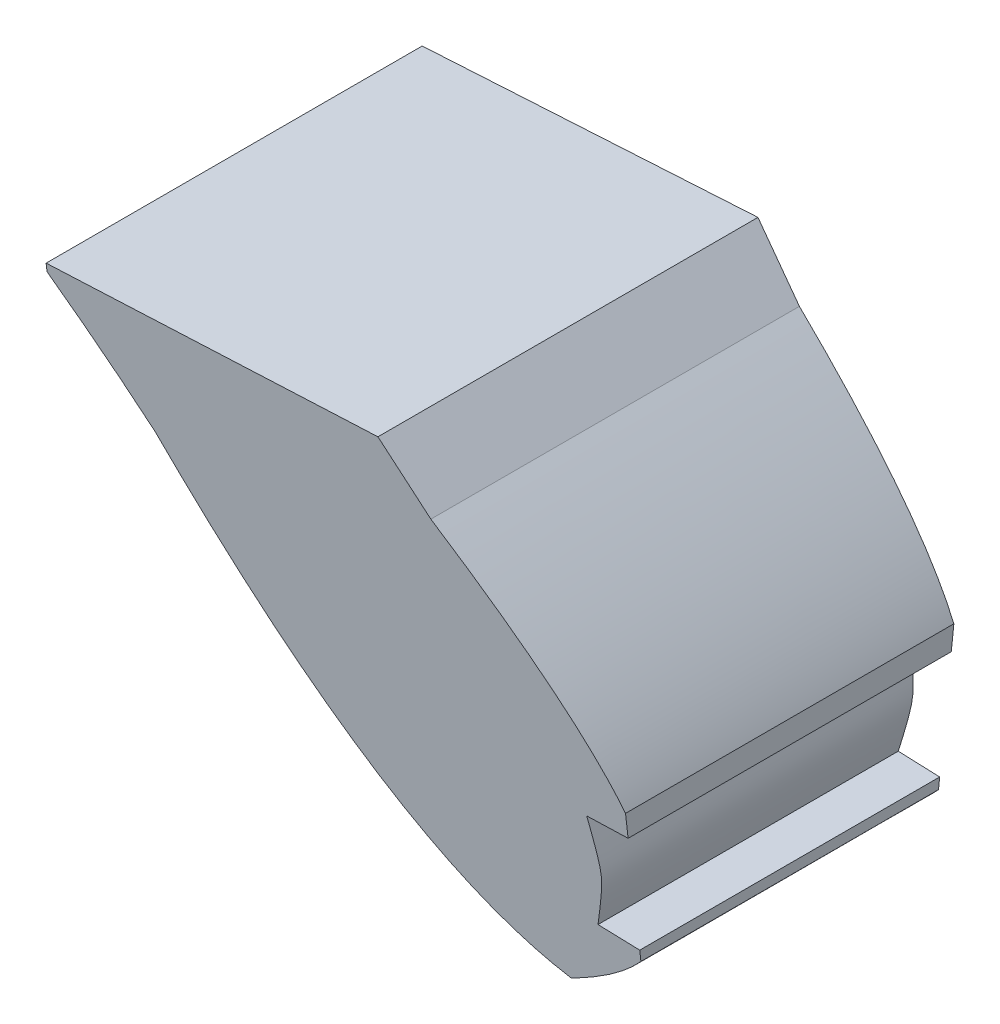
ISO-10303-21;
HEADER;
FILE_DESCRIPTION(('STEP AP214'),'2;1');
FILE_NAME('part.step','',(''),(''),'','','');
FILE_SCHEMA(('AUTOMOTIVE_DESIGN { 1 0 10303 214 1 1 1 1 }'));
ENDSEC;
DATA;
#1=APPLICATION_CONTEXT('core data for automotive mechanical design processes');
#2=APPLICATION_PROTOCOL_DEFINITION('international standard','automotive_design',2000,#1);
#3=PRODUCT_CONTEXT('',#1,'mechanical');
#4=PRODUCT('Part','Part','',(#3));
#5=PRODUCT_RELATED_PRODUCT_CATEGORY('part','',(#4));
#6=PRODUCT_DEFINITION_FORMATION('','',#4);
#7=PRODUCT_DEFINITION_CONTEXT('part definition',#1,'design');
#8=PRODUCT_DEFINITION('design','',#6,#7);
#9=PRODUCT_DEFINITION_SHAPE('','',#8);
#10=(LENGTH_UNIT() NAMED_UNIT(*) SI_UNIT(.MILLI.,.METRE.));
#11=(NAMED_UNIT(*) PLANE_ANGLE_UNIT() SI_UNIT($,.RADIAN.));
#12=(NAMED_UNIT(*) SI_UNIT($,.STERADIAN.) SOLID_ANGLE_UNIT());
#13=UNCERTAINTY_MEASURE_WITH_UNIT(LENGTH_MEASURE(1.E-05),#10,'distance_accuracy_value','');
#14=(GEOMETRIC_REPRESENTATION_CONTEXT(3) GLOBAL_UNCERTAINTY_ASSIGNED_CONTEXT((#13)) GLOBAL_UNIT_ASSIGNED_CONTEXT((#10,
#11,#12)) REPRESENTATION_CONTEXT('',''));
#15=CARTESIAN_POINT('',(0.,0.,0.));
#16=DIRECTION('',(0.,0.,1.));
#17=DIRECTION('',(1.,0.,0.));
#18=AXIS2_PLACEMENT_3D('',#15,#16,#17);
#19=CARTESIAN_POINT('',(0.355125000055651,-1.23774703808888E-13,8.));
#20=DIRECTION('',(-1.,3.48538412642003E-13,0.));
#21=DIRECTION('',(-3.48538412642003E-13,-1.,0.));
#22=AXIS2_PLACEMENT_3D('',#19,#20,#21);
#23=PLANE('',#22);
#24=DIRECTION('',(0.,-0.993653373689782,0.112485434412263));
#25=VECTOR('',#24,1.);
#26=CARTESIAN_POINT('',(0.355125000056697,12.6081551722012,-8.));
#27=LINE('',#26,#25);
#28=CARTESIAN_POINT('',(0.355125000056697,3.0015495286345,-6.91249480185305));
#29=VERTEX_POINT('',#28);
#30=CARTESIAN_POINT('',(0.355125000056447,2.03738091179555,-6.80334715682562));
#31=VERTEX_POINT('',#30);
#32=EDGE_CURVE('E59',#29,#31,#27,.T.);
#33=ORIENTED_EDGE('',*,*,#32,.F.);
#34=DIRECTION('',(0.,0.,-1.));
#35=VECTOR('',#34,1.);
#36=CARTESIAN_POINT('',(0.355125000056697,3.0015495286345,8.));
#37=LINE('',#36,#35);
#38=CARTESIAN_POINT('',(0.355125000056697,3.0015495286345,6.91249480185305));
#39=VERTEX_POINT('',#38);
#40=EDGE_CURVE('E179',#39,#29,#37,.T.);
#41=ORIENTED_EDGE('',*,*,#40,.F.);
#42=DIRECTION('',(0.,0.993653373689782,0.112485434412263));
#43=VECTOR('',#42,1.);
#44=CARTESIAN_POINT('',(0.355125000056697,12.6081551722012,8.));
#45=LINE('',#44,#43);
#46=CARTESIAN_POINT('',(0.355125000056697,2.03738091179556,6.80334715682562));
#47=VERTEX_POINT('',#46);
#48=EDGE_CURVE('E151',#47,#39,#45,.T.);
#49=ORIENTED_EDGE('',*,*,#48,.F.);
#50=DIRECTION('',(0.,0.,-1.));
#51=VECTOR('',#50,1.);
#52=CARTESIAN_POINT('',(0.355125000056447,2.03738091179555,8.));
#53=LINE('',#52,#51);
#54=EDGE_CURVE('E166',#47,#31,#53,.T.);
#55=ORIENTED_EDGE('',*,*,#54,.T.);
#56=EDGE_LOOP('',(#33,#41,#49,#55));
#57=FACE_BOUND('',#56,.T.);
#58=ADVANCED_FACE('F41',(#57),#23,.F.);
#59=CARTESIAN_POINT('',(-23.0359211456035,0.,8.));
#60=DIRECTION('',(-1.,0.,0.));
#61=DIRECTION('',(0.,0.,1.));
#62=AXIS2_PLACEMENT_3D('',#59,#60,#61);
#63=PLANE('',#62);
#64=DIRECTION('',(0.,0.,-1.));
#65=VECTOR('',#64,1.);
#66=CARTESIAN_POINT('',(-23.0359211456035,11.8716122879342,8.));
#67=LINE('',#66,#65);
#68=CARTESIAN_POINT('',(-23.0359211456035,11.8716122879342,7.91662047501294));
#69=VERTEX_POINT('',#68);
#70=CARTESIAN_POINT('',(-23.0359211456035,11.8716122879342,-7.91662047501294));
#71=VERTEX_POINT('',#70);
#72=EDGE_CURVE('E187',#69,#71,#67,.T.);
#73=ORIENTED_EDGE('',*,*,#72,.T.);
#74=DIRECTION('',(0.,-0.993653373689782,0.112485434412263));
#75=VECTOR('',#74,1.);
#76=CARTESIAN_POINT('',(-23.0359211456035,12.6081551722012,-8.));
#77=LINE('',#76,#75);
#78=CARTESIAN_POINT('',(-23.0359211456035,11.5401378200983,-7.87909627341673));
#79=VERTEX_POINT('',#78);
#80=EDGE_CURVE('E317',#71,#79,#77,.T.);
#81=ORIENTED_EDGE('',*,*,#80,.T.);
#82=DIRECTION('',(0.,0.,-1.));
#83=VECTOR('',#82,1.);
#84=CARTESIAN_POINT('',(-23.0359211456035,11.5401378200983,8.));
#85=LINE('',#84,#83);
#86=CARTESIAN_POINT('',(-23.0359211456035,11.5401378200983,7.87909627341673));
#87=VERTEX_POINT('',#86);
#88=EDGE_CURVE('E193',#87,#79,#85,.T.);
#89=ORIENTED_EDGE('',*,*,#88,.F.);
#90=DIRECTION('',(0.,0.993653373689782,0.112485434412263));
#91=VECTOR('',#90,1.);
#92=CARTESIAN_POINT('',(-23.0359211456035,12.6081551722012,8.));
#93=LINE('',#92,#91);
#94=EDGE_CURVE('E320',#87,#69,#93,.T.);
#95=ORIENTED_EDGE('',*,*,#94,.T.);
#96=EDGE_LOOP('',(#73,#81,#89,#95));
#97=FACE_BOUND('',#96,.T.);
#98=ADVANCED_FACE('F316',(#97),#63,.T.);
#99=CARTESIAN_POINT('',(-18.9451921135982,7.54091889574655,8.));
#100=CARTESIAN_POINT('',(-10.2150083842792,-3.69764410322756,8.));
#101=CARTESIAN_POINT('',(-2.84660482498738,-5.05908110388432,8.));
#102=(BOUNDED_CURVE() B_SPLINE_CURVE(2,(#99,#100,#101),.UNSPECIFIED.,.F.,
.F.) B_SPLINE_CURVE_WITH_KNOTS((3,3),(0.497667241108509,0.499554279588011),
.UNSPECIFIED.) CURVE() GEOMETRIC_REPRESENTATION_ITEM() RATIONAL_B_SPLINE_CURVE((1.,1.,1.)) REPRESENTATION_ITEM(''));
#103=DIRECTION('',(0.,0.,-1.));
#104=VECTOR('',#103,1.);
#105=SURFACE_OF_LINEAR_EXTRUSION('',#102,#104);
#106=DIRECTION('',(0.,0.,-1.));
#107=VECTOR('',#106,1.);
#108=CARTESIAN_POINT('',(-18.9451921135982,7.54091889574657,8.));
#109=LINE('',#108,#107);
#110=CARTESIAN_POINT('',(-18.9451921135982,7.54091889574657,7.42636910524442));
#111=VERTEX_POINT('',#110);
#112=CARTESIAN_POINT('',(-18.9451921135982,7.54091889574657,-7.42636910524442));
#113=VERTEX_POINT('',#112);
#114=EDGE_CURVE('E194',#111,#113,#109,.T.);
#115=ORIENTED_EDGE('',*,*,#114,.T.);
#116=CARTESIAN_POINT('',(-18.9451921135982,7.54091889574655,-7.42636910524441));
#117=CARTESIAN_POINT('',(-18.7033608655423,7.22962108931645,-7.39112898035273));
#118=CARTESIAN_POINT('',(-18.4592647140916,6.9200497206851,-7.35608429494821));
#119=CARTESIAN_POINT('',(-17.9661198805234,6.30464603742845,-7.28641819962467));
#120=CARTESIAN_POINT('',(-17.7170694462669,5.99881510969872,-7.25179694670763));
#121=CARTESIAN_POINT('',(-17.2137366178937,5.3913665824337,-7.18303140604553));
#122=CARTESIAN_POINT('',(-16.9594535947769,5.08974949683998,-7.14888717648066));
#123=CARTESIAN_POINT('',(-16.4451285665965,4.49103725761873,-7.08111061767257));
#124=CARTESIAN_POINT('',(-16.1850826962375,4.19394537928884,-7.04747865920581));
#125=CARTESIAN_POINT('',(-15.6590118901181,3.60508061675355,-6.9808168731366));
#126=CARTESIAN_POINT('',(-15.3929875534481,3.31330720485499,-6.94778698579723));
#127=CARTESIAN_POINT('',(-14.8544901847056,2.7357195544677,-6.88240181277285));
#128=CARTESIAN_POINT('',(-14.5820174931064,2.44990500284308,-6.85004649163962));
#129=CARTESIAN_POINT('',(-13.9777704357619,1.83142011947111,-6.78003159245484));
#130=CARTESIAN_POINT('',(-13.6445482479649,1.50014167377654,-6.74252958132897));
#131=CARTESIAN_POINT('',(-12.9673134934436,0.848664446736888,-6.66877982026176));
#132=CARTESIAN_POINT('',(-12.623301443116,0.528465136688493,-6.63253201046914));
#133=CARTESIAN_POINT('',(-11.9227759490938,-0.0995013958587513,-6.5614437516454));
#134=CARTESIAN_POINT('',(-11.5662405708663,-0.407244542107335,-6.52660602813964));
#135=CARTESIAN_POINT('',(-10.840142749037,-1.00720368374379,-6.45868831511867));
#136=CARTESIAN_POINT('',(-10.4705807273197,-1.29942018121482,-6.4256082687657));
#137=CARTESIAN_POINT('',(-9.71382699072171,-1.86779135556405,-6.36126643674768));
#138=CARTESIAN_POINT('',(-9.32650636654571,-2.14377746328672,-6.330023733768));
#139=CARTESIAN_POINT('',(-8.5360986768139,-2.67282289543975,-6.27013372902864));
#140=CARTESIAN_POINT('',(-8.13300835344273,-2.92587744631612,-6.24148696765387));
#141=CARTESIAN_POINT('',(-7.31201826568453,-3.40280761684766,-6.18749661363601));
#142=CARTESIAN_POINT('',(-6.89419365451789,-3.62680992502778,-6.16213867935817));
#143=CARTESIAN_POINT('',(-6.04187322097519,-4.0405536088069,-6.11530128189388));
#144=CARTESIAN_POINT('',(-5.60738935372736,-4.23031901573022,-6.09381909826786));
#145=CARTESIAN_POINT('',(-4.78985442909107,-4.54236533838515,-6.05849423842238));
#146=CARTESIAN_POINT('',(-4.4091055725695,-4.67052923075731,-6.04398558631979));
#147=CARTESIAN_POINT('',(-3.82960691198316,-4.83674345690554,-6.02516948814227));
#148=CARTESIAN_POINT('',(-3.63462104960687,-4.8878904691115,-6.01937944702812));
#149=CARTESIAN_POINT('',(-3.24229120544362,-4.9807402777546,-6.00886848683127));
#150=CARTESIAN_POINT('',(-3.0449461414238,-5.02243854990591,-6.00414807991536));
#151=CARTESIAN_POINT('',(-2.84660482498738,-5.05908110388432,-6.));
#152=B_SPLINE_CURVE_WITH_KNOTS('',3,(#116,#117,#118,#119,#120,#121,#122,#123,#124,#125,#126,
#127,#128,#129,#130,#131,#132,#133,#134,#135,#136,#137,#138,#139,#140,#141,#142,#143,#144,#145,
#146,#147,#148,#149,#150,#151),.UNSPECIFIED.,.F.,.F.,(4,2,2,2,2,2,2,2,2,2,2,2,2,2,2,2,2,4),(0.,
1.1872997216569,2.37502708567824,3.56289806807204,4.75159146291787,5.9401662676152,
7.12867845491363,8.54255640265696,9.95636678593971,11.3727907462706,12.7891688759803,
14.2183172044781,15.6477623519031,17.0707480146133,18.4927309460623,19.6971402338765,
20.3019233237111,20.9069953892921),.UNSPECIFIED.);
#153=CARTESIAN_POINT('',(-2.84660482498738,-5.05908110388432,-6.));
#154=VERTEX_POINT('',#153);
#155=EDGE_CURVE('E255',#113,#154,#152,.T.);
#156=ORIENTED_EDGE('',*,*,#155,.T.);
#157=DIRECTION('',(0.,0.,-1.));
#158=VECTOR('',#157,1.);
#159=CARTESIAN_POINT('',(-2.84660482498738,-5.05908110388432,8.));
#160=LINE('',#159,#158);
#161=CARTESIAN_POINT('',(-2.84660482498738,-5.05908110388432,6.));
#162=VERTEX_POINT('',#161);
#163=EDGE_CURVE('E156',#162,#154,#160,.T.);
#164=ORIENTED_EDGE('',*,*,#163,.F.);
#165=CARTESIAN_POINT('',(-2.84660482498738,-5.05908110388432,6.));
#166=CARTESIAN_POINT('',(-3.0836355452615,-5.01529762547054,6.00495646039138));
#167=CARTESIAN_POINT('',(-3.31925014057108,-4.96428184629726,6.01073164541478));
#168=CARTESIAN_POINT('',(-3.78628189704186,-4.84911384389608,6.02376911212451));
#169=CARTESIAN_POINT('',(-4.01771143135529,-4.78501130060695,6.03102576984815));
#170=CARTESIAN_POINT('',(-4.47638324853452,-4.64477679089168,6.04690086287615));
#171=CARTESIAN_POINT('',(-4.70363211310207,-4.56866593727755,6.05551690812791));
#172=CARTESIAN_POINT('',(-5.15398016115681,-4.40545252874729,6.07399330205617));
#173=CARTESIAN_POINT('',(-5.37708095327682,-4.31835434125152,6.08385315632366));
#174=CARTESIAN_POINT('',(-5.81545834234536,-4.13567110279715,6.10453361087802));
#175=CARTESIAN_POINT('',(-6.03080317783365,-4.04024711994086,6.11533597762798));
#176=CARTESIAN_POINT('',(-6.45748946905634,-3.84057736608456,6.13793937192646));
#177=CARTESIAN_POINT('',(-6.66882789943329,-3.73632522989765,6.14974112003892));
#178=CARTESIAN_POINT('',(-7.08747417766979,-3.51983158147829,6.17424904476877));
#179=CARTESIAN_POINT('',(-7.29477947597257,-3.40758521204135,6.18695577124062));
#180=CARTESIAN_POINT('',(-7.70530843131035,-3.17590609220346,6.21318275051655));
#181=CARTESIAN_POINT('',(-7.90853147430462,-3.0564722713248,6.22670312450288));
#182=CARTESIAN_POINT('',(-8.45410340689061,-2.72385368196738,6.26435684511426));
#183=CARTESIAN_POINT('',(-8.79259906035209,-2.50440768840731,6.28919898682003));
#184=CARTESIAN_POINT('',(-9.45845448583479,-2.04949644973372,6.3406967119384));
#185=CARTESIAN_POINT('',(-9.78581359629267,-1.81403025542841,6.3673524028032));
#186=CARTESIAN_POINT('',(-10.4302582396863,-1.32938575303013,6.42221604925302));
#187=CARTESIAN_POINT('',(-10.7473396395034,-1.08020203459831,6.45042461730948));
#188=CARTESIAN_POINT('',(-11.3718438106499,-0.570176876647104,6.50816145288252));
#189=CARTESIAN_POINT('',(-11.6792662750814,-0.309335067346119,6.53768976225981));
#190=CARTESIAN_POINT('',(-12.2887351366992,0.225514030316342,6.59823676455314));
#191=CARTESIAN_POINT('',(-12.5906756597182,0.499640146613562,6.62926890925461));
#192=CARTESIAN_POINT('',(-13.1859914625247,1.05668157973797,6.69232817041119));
#193=CARTESIAN_POINT('',(-13.4793699933214,1.33959347409339,6.72435489942917));
#194=CARTESIAN_POINT('',(-14.0582984741035,1.91313890151101,6.78928247705987));
#195=CARTESIAN_POINT('',(-14.3438493181123,2.20377154523463,6.82218322499598));
#196=CARTESIAN_POINT('',(-14.9077244427009,2.7918210558895,6.88875272137508));
#197=CARTESIAN_POINT('',(-15.1860493084316,3.08923736980037,6.92242140721399));
#198=CARTESIAN_POINT('',(-15.7683607406539,3.72540309630891,6.99443784674841));
#199=CARTESIAN_POINT('',(-16.0715178451228,4.06490144250158,7.03287038264566));
#200=CARTESIAN_POINT('',(-16.6701836985208,4.7504922746204,7.11048193675692));
#201=CARTESIAN_POINT('',(-16.9656923307507,5.09658486102068,7.14966096634501));
#202=CARTESIAN_POINT('',(-17.4495199616275,5.67490501691598,7.21512906184765));
#203=CARTESIAN_POINT('',(-17.6398456690967,5.90547984199544,7.24123103065322));
#204=CARTESIAN_POINT('',(-18.0176052393411,6.36895711711416,7.29369846448112));
#205=CARTESIAN_POINT('',(-18.205039097963,6.60185957049552,7.3200639298818));
#206=CARTESIAN_POINT('',(-18.5771476687389,7.06981539005112,7.37303835239394));
#207=CARTESIAN_POINT('',(-18.7618224957771,7.30486866600559,7.39964729929217));
#208=CARTESIAN_POINT('',(-18.9451921135982,7.54091889574655,7.42636910524441));
#209=B_SPLINE_CURVE_WITH_KNOTS('',3,(#165,#166,#167,#168,#169,#170,#171,#172,#173,#174,#175,
#176,#177,#178,#179,#180,#181,#182,#183,#184,#185,#186,#187,#188,#189,#190,#191,#192,#193,#194,
#195,#196,#197,#198,#199,#200,#201,#202,#203,#204,#205,#206,#207,#208),.UNSPECIFIED.,.F.,.F.,(4,
2,2,2,2,2,2,2,2,2,2,2,2,2,2,2,2,2,2,2,2,4),(0.,0.723070627629283,1.44344574109941,
2.16256813451498,2.88140557514503,3.58855192345824,4.2962125448096,5.0043068623572,
5.71250690363926,6.92441762508089,8.13640021448464,9.3488642962315,10.5613668633146,
11.788141520998,13.0144441434254,14.2406061176645,15.4666684871313,16.8368576095009,
18.2070676256843,19.1073954524656,20.0077245721621,20.9080160976373),.UNSPECIFIED.);
#210=EDGE_CURVE('E134',#162,#111,#209,.T.);
#211=ORIENTED_EDGE('',*,*,#210,.T.);
#212=EDGE_LOOP('',(#115,#156,#164,#211));
#213=FACE_BOUND('',#212,.T.);
#214=ADVANCED_FACE('F43',(#213),#105,.F.);
#215=CARTESIAN_POINT('',(-2.84660482498738,-5.05908110388432,8.));
#216=CARTESIAN_POINT('',(-0.742366881974002,-3.93520659958673,8.));
#217=CARTESIAN_POINT('',(0.355124999965198,-2.72325322699678,8.));
#218=(BOUNDED_CURVE() B_SPLINE_CURVE(2,(#215,#216,#217),.UNSPECIFIED.,.F.,
.F.) B_SPLINE_CURVE_WITH_KNOTS((3,3),(0.498812074629495,0.499412845463797),
.UNSPECIFIED.) CURVE() GEOMETRIC_REPRESENTATION_ITEM() RATIONAL_B_SPLINE_CURVE((1.,1.,1.)) REPRESENTATION_ITEM(''));
#219=DIRECTION('',(0.,0.,-1.));
#220=VECTOR('',#219,1.);
#221=SURFACE_OF_LINEAR_EXTRUSION('',#218,#220);
#222=ORIENTED_EDGE('',*,*,#163,.T.);
#223=CARTESIAN_POINT('',(-2.84660482498738,-5.05908110388432,-6.));
#224=CARTESIAN_POINT('',(-2.67154367534484,-4.96554243060771,-6.01058894235803));
#225=CARTESIAN_POINT('',(-2.49778385523126,-4.86952307483158,-6.02145870764283));
#226=CARTESIAN_POINT('',(-2.15332890723938,-4.67164155861341,-6.04385966647148));
#227=CARTESIAN_POINT('',(-1.9826387176766,-4.56977092703724,-6.05539181898071));
#228=CARTESIAN_POINT('',(-1.64527137465746,-4.35955519460265,-6.0791890591545));
#229=CARTESIAN_POINT('',(-1.47859514121983,-4.25120862887406,-6.09145431264808));
#230=CARTESIAN_POINT('',(-1.15044448784201,-4.02724001195876,-6.11680843294344));
#231=CARTESIAN_POINT('',(-0.98896568487432,-3.911624347545,-6.12989657673763));
#232=CARTESIAN_POINT('',(-0.724614348138144,-3.7114805449727,-6.15255363519824));
#233=CARTESIAN_POINT('',(-0.619967455079453,-3.6292658395869,-6.16186066025876));
#234=CARTESIAN_POINT('',(-0.414118763296717,-3.46070156785231,-6.18094279275538));
#235=CARTESIAN_POINT('',(-0.312916415666604,-3.3743526656372,-6.19071782500895));
#236=CARTESIAN_POINT('',(-0.114288127047668,-3.19685300163986,-6.21081147873311));
#237=CARTESIAN_POINT('',(-0.0168745915935633,-3.10568844995875,-6.221131661274));
#238=CARTESIAN_POINT('',(0.173044677325634,-2.91833195578561,-6.24234114658855));
#239=CARTESIAN_POINT('',(0.265547074526193,-2.82213668167119,-6.25323082651485));
#240=CARTESIAN_POINT('',(0.355124999965198,-2.72325322699678,-6.26442481895704));
#241=B_SPLINE_CURVE_WITH_KNOTS('',3,(#223,#224,#225,#226,#227,#228,#229,#230,#231,#232,#233,
#234,#235,#236,#237,#238,#239,#240),.UNSPECIFIED.,.F.,.F.,(4,2,2,2,2,2,2,2,4),(0.,
0.596333361221147,1.19355295493407,1.79090815604603,2.38774565156578,2.78786762990545,
3.18792554534165,3.58919872466333,3.99074110013676),.UNSPECIFIED.);
#242=CARTESIAN_POINT('',(0.355125000010947,-2.72325322699678,-6.26442481895704));
#243=VERTEX_POINT('',#242);
#244=EDGE_CURVE('E154',#154,#243,#241,.T.);
#245=ORIENTED_EDGE('',*,*,#244,.T.);
#246=DIRECTION('',(0.,0.,-1.));
#247=VECTOR('',#246,1.);
#248=CARTESIAN_POINT('',(0.355124999965198,-2.72325322699678,8.));
#249=LINE('',#248,#247);
#250=CARTESIAN_POINT('',(0.355125000010947,-2.72325322699678,6.26442481895704));
#251=VERTEX_POINT('',#250);
#252=EDGE_CURVE('E150',#251,#243,#249,.T.);
#253=ORIENTED_EDGE('',*,*,#252,.F.);
#254=CARTESIAN_POINT('',(0.355124999965198,-2.72325322699678,6.26442481895704));
#255=CARTESIAN_POINT('',(0.288265800066398,-2.79707578870119,6.25606781726749));
#256=CARTESIAN_POINT('',(0.219762299322532,-2.86939557158838,6.24788093599675));
#257=CARTESIAN_POINT('',(0.0798741499126207,-3.0111837154317,6.23182996553057));
#258=CARTESIAN_POINT('',(0.00849051694650468,-3.08065306448068,6.22396576447915));
#259=CARTESIAN_POINT('',(-0.209110404202349,-3.28478130911614,6.20085765164865));
#260=CARTESIAN_POINT('',(-0.359086186155244,-3.41549544786354,6.18606030171743));
#261=CARTESIAN_POINT('',(-0.666431647279958,-3.66745151891472,6.15753789253991));
#262=CARTESIAN_POINT('',(-0.823790135326829,-3.78870709059741,6.14381128926277));
#263=CARTESIAN_POINT('',(-1.14463764434189,-4.02329424679429,6.11725510893767));
#264=CARTESIAN_POINT('',(-1.30813354467851,-4.13661650521983,6.1044265876393));
#265=CARTESIAN_POINT('',(-1.58497175174893,-4.31986712055689,6.08368190381061));
#266=CARTESIAN_POINT('',(-1.69701528140079,-4.39175032218513,6.07554444523986));
#267=CARTESIAN_POINT('',(-1.92294333828473,-4.53261962763427,6.05959749086083));
#268=CARTESIAN_POINT('',(-2.03682799400811,-4.6016055280346,6.05178801808056));
#269=CARTESIAN_POINT('',(-2.26591352019373,-4.73675126913538,6.0364889934919));
#270=CARTESIAN_POINT('',(-2.38111062922232,-4.80291742324192,6.02899872698133));
#271=CARTESIAN_POINT('',(-2.6128736149529,-4.93278949726635,6.01429670205848));
#272=CARTESIAN_POINT('',(-2.72943923096306,-4.99649587614853,6.00708489168965));
#273=CARTESIAN_POINT('',(-2.84660482498738,-5.05908110388432,6.));
#274=B_SPLINE_CURVE_WITH_KNOTS('',3,(#254,#255,#256,#257,#258,#259,#260,#261,#262,#263,#264,
#265,#266,#267,#268,#269,#270,#271,#272,#273),.UNSPECIFIED.,.F.,.F.,(4,2,2,2,2,2,2,2,2,4),(0.,
0.299782926841572,0.599461041577767,1.1974499434567,1.79455995327913,2.39236050766276,
2.79242459253001,3.19251671924541,3.59166012626068,3.99072869445439),.UNSPECIFIED.);
#275=EDGE_CURVE('E129',#251,#162,#274,.T.);
#276=ORIENTED_EDGE('',*,*,#275,.T.);
#277=EDGE_LOOP('',(#222,#245,#253,#276));
#278=FACE_BOUND('',#277,.T.);
#279=ADVANCED_FACE('F152',(#278),#221,.F.);
#280=CARTESIAN_POINT('',(0.355125000532009,-7.39148800447813E-11,8.));
#281=DIRECTION('',(1.,-2.08137641489758E-10,0.));
#282=DIRECTION('',(2.08137641489758E-10,1.,0.));
#283=AXIS2_PLACEMENT_3D('',#280,#281,#282);
#284=PLANE('',#283);
#285=CARTESIAN_POINT('',(0.355125000056697,-2.28484178142546,-6.31405470319249));
#286=VERTEX_POINT('',#285);
#287=EDGE_CURVE('E147',#286,#243,#27,.T.);
#288=ORIENTED_EDGE('',*,*,#287,.F.);
#289=DIRECTION('',(0.,0.,-1.));
#290=VECTOR('',#289,1.);
#291=CARTESIAN_POINT('',(0.355125000056447,-2.28484178142545,8.));
#292=LINE('',#291,#290);
#293=CARTESIAN_POINT('',(0.355125000056697,-2.28484178142546,6.31405470319249));
#294=VERTEX_POINT('',#293);
#295=EDGE_CURVE('E149',#294,#286,#292,.T.);
#296=ORIENTED_EDGE('',*,*,#295,.F.);
#297=EDGE_CURVE('E135',#251,#294,#45,.T.);
#298=ORIENTED_EDGE('',*,*,#297,.F.);
#299=ORIENTED_EDGE('',*,*,#252,.T.);
#300=EDGE_LOOP('',(#288,#296,#298,#299));
#301=FACE_BOUND('',#300,.T.);
#302=ADVANCED_FACE('F148',(#301),#284,.T.);
#303=CARTESIAN_POINT('',(-0.0792587195419091,-2.26967276768239,8.));
#304=DIRECTION('',(-0.0348994967024901,-0.999390827019096,0.));
#305=DIRECTION('',(0.999390827019096,-0.0348994967024901,0.));
#306=AXIS2_PLACEMENT_3D('',#303,#304,#305);
#307=PLANE('',#306);
#308=ORIENTED_EDGE('',*,*,#295,.T.);
#309=DIRECTION('',(-0.999383027616045,0.034899224341334,-0.00395072820626436));
#310=VECTOR('',#309,1.);
#311=CARTESIAN_POINT('',(-0.0227358902769028,-2.27164658837418,-6.3155484504708));
#312=LINE('',#311,#310);
#313=CARTESIAN_POINT('',(-1.39487499994356,-2.22373043481491,-6.3209727457947));
#314=VERTEX_POINT('',#313);
#315=EDGE_CURVE('E299',#286,#314,#312,.T.);
#316=ORIENTED_EDGE('',*,*,#315,.T.);
#317=DIRECTION('',(0.,0.,-1.));
#318=VECTOR('',#317,1.);
#319=CARTESIAN_POINT('',(-1.39487499994356,-2.22373043481491,8.));
#320=LINE('',#319,#318);
#321=CARTESIAN_POINT('',(-1.39487499994356,-2.22373043481491,6.3209727457947));
#322=VERTEX_POINT('',#321);
#323=EDGE_CURVE('E157',#322,#314,#320,.T.);
#324=ORIENTED_EDGE('',*,*,#323,.F.);
#325=DIRECTION('',(0.999383027616045,-0.034899224341334,-0.00395072820626436));
#326=VECTOR('',#325,1.);
#327=CARTESIAN_POINT('',(-0.0859085417339361,-2.26944055077446,6.31579818252456));
#328=LINE('',#327,#326);
#329=EDGE_CURVE('E325',#322,#294,#328,.T.);
#330=ORIENTED_EDGE('',*,*,#329,.T.);
#331=EDGE_LOOP('',(#308,#316,#324,#330));
#332=FACE_BOUND('',#331,.T.);
#333=ADVANCED_FACE('F334',(#332),#307,.F.);
#334=CARTESIAN_POINT('',(-1.39487499994356,-2.22373043481491,8.));
#335=CARTESIAN_POINT('',(-0.907530669798052,-0.123730434814926,8.));
#336=CARTESIAN_POINT('',(-1.39487499994356,1.976269565185,8.));
#337=(BOUNDED_CURVE() B_SPLINE_CURVE(2,(#334,#335,#336),.UNSPECIFIED.,.F.,
.F.) B_SPLINE_CURVE_WITH_KNOTS((3,3),(0.,1.),
.UNSPECIFIED.) CURVE() GEOMETRIC_REPRESENTATION_ITEM() RATIONAL_B_SPLINE_CURVE((1.,
3.23180121851367,1.)) REPRESENTATION_ITEM(''));
#338=DIRECTION('',(0.,0.,-1.));
#339=VECTOR('',#338,1.);
#340=SURFACE_OF_LINEAR_EXTRUSION('',#337,#339);
#341=ORIENTED_EDGE('',*,*,#323,.T.);
#342=CARTESIAN_POINT('',(-1.39487499994356,-2.22373043481491,-6.3209727457947));
#343=CARTESIAN_POINT('',(-1.38202447122813,-2.16835021356968,-6.32724200266994));
#344=CARTESIAN_POINT('',(-1.36921744547373,-2.11295996104296,-6.33351239512535));
#345=CARTESIAN_POINT('',(-1.34371955909939,-2.00215267308472,-6.34605621196536));
#346=CARTESIAN_POINT('',(-1.33102869927897,-1.94673563747162,-6.35232963637053));
#347=CARTESIAN_POINT('',(-1.30579250980865,-1.83586894873068,-6.36488017761064));
#348=CARTESIAN_POINT('',(-1.29324717983284,-1.78041929567618,-6.37115729443729));
#349=CARTESIAN_POINT('',(-1.26834035470031,-1.66945670178657,-6.383718692514));
#350=CARTESIAN_POINT('',(-1.25597893242913,-1.61394374477822,-6.39000297559494));
#351=CARTESIAN_POINT('',(-1.23150428056634,-1.50286329328951,-6.40257771561119));
#352=CARTESIAN_POINT('',(-1.21939105277074,-1.44729579841754,-6.40886817259083));
#353=CARTESIAN_POINT('',(-1.19550012207595,-1.33608743052918,-6.42145739324204));
#354=CARTESIAN_POINT('',(-1.1837224309966,-1.2804465549999,-6.42775615719808));
#355=CARTESIAN_POINT('',(-1.15485704104805,-1.14125615214793,-6.44351305326002));
#356=CARTESIAN_POINT('',(-1.13805530724695,-1.05764770999797,-6.45297785475397));
#357=CARTESIAN_POINT('',(-1.10616760722362,-0.890046794372652,-6.47195093158457));
#358=CARTESIAN_POINT('',(-1.09108267359643,-0.806054121054038,-6.48145922954426));
#359=CARTESIAN_POINT('',(-1.06839764881353,-0.664871544058104,-6.49744164748328));
#360=CARTESIAN_POINT('',(-1.05995626751594,-0.607817685780514,-6.50390036659317));
#361=CARTESIAN_POINT('',(-1.04516806244473,-0.493450404650502,-6.51684718853439));
#362=CARTESIAN_POINT('',(-1.03882061818002,-0.436137063802354,-6.52333528208253));
#363=CARTESIAN_POINT('',(-1.02903068414648,-0.32130807468907,-6.53633437116685));
#364=CARTESIAN_POINT('',(-1.02558541499307,-0.263792673078832,-6.54284533878074));
#365=CARTESIAN_POINT('',(-1.02222407231355,-0.148714957691158,-6.55587258464867));
#366=CARTESIAN_POINT('',(-1.02230420900467,-0.0911527608046729,-6.56238884967019));
#367=CARTESIAN_POINT('',(-1.02596900528622,0.0239015023985968,-6.57541344065945));
#368=CARTESIAN_POINT('',(-1.02955657044098,0.0813934710005595,-6.58192175556548));
#369=CARTESIAN_POINT('',(-1.03959132289802,0.196133385303809,-6.59491076103415));
#370=CARTESIAN_POINT('',(-1.04603929917214,0.253381259276288,-6.60139144347682));
#371=CARTESIAN_POINT('',(-1.05997220439613,0.35983137212623,-6.6134420111136));
#372=CARTESIAN_POINT('',(-1.06719667195452,0.409068491171902,-6.61901584487869));
#373=CARTESIAN_POINT('',(-1.08274764683563,0.507347946837771,-6.63014146227917));
#374=CARTESIAN_POINT('',(-1.0910737056158,0.556390354412902,-6.63569325394695));
#375=CARTESIAN_POINT('',(-1.10853037258208,0.654424381213791,-6.64679108784343));
#376=CARTESIAN_POINT('',(-1.11766242226862,0.70341574413319,-6.65233710105724));
#377=CARTESIAN_POINT('',(-1.1364977866421,0.801294033672846,-6.6634173048888));
#378=CARTESIAN_POINT('',(-1.14620115522269,0.850180949988232,-6.66895149433999));
#379=CARTESIAN_POINT('',(-1.16833495400599,0.959258362431622,-6.68129948252998));
#380=CARTESIAN_POINT('',(-1.1808737668477,1.01942705832357,-6.68811081339709));
#381=CARTESIAN_POINT('',(-1.20639174214038,1.13967062360227,-6.70172285360526));
#382=CARTESIAN_POINT('',(-1.21937089694786,1.19974549459873,-6.70852356312855));
#383=CARTESIAN_POINT('',(-1.24564626429316,1.31982703510014,-6.72211726150049));
#384=CARTESIAN_POINT('',(-1.2589424791072,1.37983370411223,-6.72891025029334));
#385=CARTESIAN_POINT('',(-1.28569888355067,1.49948275843749,-6.74245498954463));
#386=CARTESIAN_POINT('',(-1.29915785770072,1.55912541262012,-6.74920677044014));
#387=CARTESIAN_POINT('',(-1.32625009614692,1.67837055204035,-6.76270578495002));
#388=CARTESIAN_POINT('',(-1.33988335761135,1.73797303791406,-6.76945301863641));
#389=CARTESIAN_POINT('',(-1.36728618039678,1.85714403003134,-6.78294363938264));
#390=CARTESIAN_POINT('',(-1.381055735056,1.91671253778666,-6.7896870266136));
#391=CARTESIAN_POINT('',(-1.39487499994356,1.976269565185,-6.79642911422342));
#392=B_SPLINE_CURVE_WITH_KNOTS('',3,(#342,#343,#344,#345,#346,#347,#348,#349,#350,#351,#352,
#353,#354,#355,#356,#357,#358,#359,#360,#361,#362,#363,#364,#365,#366,#367,#368,#369,#370,#371,
#372,#373,#374,#375,#376,#377,#378,#379,#380,#381,#382,#383,#384,#385,#386,#387,#388,#389,#390,
#391),.UNSPECIFIED.,.F.,.F.,(4,2,2,2,2,2,2,2,2,2,2,2,2,2,2,2,2,2,2,2,2,2,2,2,4),(0.,
0.171588763273453,0.343178706622211,0.514768265617105,0.686424107910212,0.858081191922479,
1.02974431538338,1.28714724145325,1.54470417716685,1.71878537631805,1.8928149439917,
2.06667765516018,2.24035346989174,2.41417328020677,2.58804106414591,2.73825198714263,
2.88840193486919,3.03882608638502,3.18926445051695,3.37477476712053,3.56028186526787,
3.74579029559563,3.93033206952695,4.11487084894101,4.29940065253389),.UNSPECIFIED.);
#393=CARTESIAN_POINT('',(-1.39487499994356,1.976269565185,-6.79642911422342));
#394=VERTEX_POINT('',#393);
#395=EDGE_CURVE('E177',#314,#394,#392,.T.);
#396=ORIENTED_EDGE('',*,*,#395,.T.);
#397=DIRECTION('',(0.,0.,-1.));
#398=VECTOR('',#397,1.);
#399=CARTESIAN_POINT('',(-1.39487499994356,1.976269565185,8.));
#400=LINE('',#399,#398);
#401=CARTESIAN_POINT('',(-1.39487499994356,1.976269565185,6.79642911422342));
#402=VERTEX_POINT('',#401);
#403=EDGE_CURVE('E170',#402,#394,#400,.T.);
#404=ORIENTED_EDGE('',*,*,#403,.F.);
#405=CARTESIAN_POINT('',(-1.39487499994356,1.976269565185,6.79642911422342));
#406=CARTESIAN_POINT('',(-1.37907511533365,1.90817072448153,6.78872006005792));
#407=CARTESIAN_POINT('',(-1.36333836969219,1.84005724657732,6.78100934890426));
#408=CARTESIAN_POINT('',(-1.33204781411177,1.703774616767,6.76558162408294));
#409=CARTESIAN_POINT('',(-1.31649404111311,1.63560545649229,6.75786460946793));
#410=CARTESIAN_POINT('',(-1.28563112684324,1.49920642241426,6.74242370722985));
#411=CARTESIAN_POINT('',(-1.27032200601989,1.43097654403409,6.73469981908867));
#412=CARTESIAN_POINT('',(-1.2399275173513,1.29390485970128,6.71918277022027));
#413=CARTESIAN_POINT('',(-1.22484485449072,1.22506245970345,6.71138954224482));
#414=CARTESIAN_POINT('',(-1.19518112320204,1.0872751663326,6.69579148364441));
#415=CARTESIAN_POINT('',(-1.18060002365467,1.01833027959621,6.68798665377074));
#416=CARTESIAN_POINT('',(-1.1521828568661,0.880291295746956,6.67236010282727));
#417=CARTESIAN_POINT('',(-1.13834675067045,0.81119720663251,6.66453838266292));
#418=CARTESIAN_POINT('',(-1.11516473949854,0.690174385789182,6.65083812768788));
#419=CARTESIAN_POINT('',(-1.10556404533104,0.638294159941606,6.64496508393199));
#420=CARTESIAN_POINT('',(-1.08728934318226,0.534373551286744,6.6332008660282));
#421=CARTESIAN_POINT('',(-1.07861528667302,0.482333177013412,6.62730969284637));
#422=CARTESIAN_POINT('',(-1.06260440200736,0.378149691610767,6.61551571627023));
#423=CARTESIAN_POINT('',(-1.05526500549272,0.326006977236308,6.60961295779011));
#424=CARTESIAN_POINT('',(-1.04244257361275,0.221494061638693,6.59778168843203));
#425=CARTESIAN_POINT('',(-1.03695934618146,0.169123884520428,6.59185318028284));
#426=CARTESIAN_POINT('',(-1.02917052981484,0.0729301509045447,6.58096367474698));
#427=CARTESIAN_POINT('',(-1.02648754730517,0.0291375389214665,6.57600618039996));
#428=CARTESIAN_POINT('',(-1.02311803398459,-0.0585228047861235,6.56608268785843));
#429=CARTESIAN_POINT('',(-1.02243133042271,-0.10239052968188,6.56111669043696));
#430=CARTESIAN_POINT('',(-1.02313587995194,-0.190112899664058,6.55118617627941));
#431=CARTESIAN_POINT('',(-1.02452732528276,-0.233967543165022,6.54622165972282));
#432=CARTESIAN_POINT('',(-1.02922830316647,-0.321575626235211,6.53630408328911));
#433=CARTESIAN_POINT('',(-1.03253802615093,-0.365329055323648,6.53135102459847));
#434=CARTESIAN_POINT('',(-1.04481913269156,-0.496026010219697,6.51655561994619));
#435=CARTESIAN_POINT('',(-1.05614963950478,-0.582745183351363,6.50673867158183));
#436=CARTESIAN_POINT('',(-1.08246686740171,-0.755641929816292,6.48716608606103));
#437=CARTESIAN_POINT('',(-1.09745579058543,-0.841819144762869,6.47741048947537));
#438=CARTESIAN_POINT('',(-1.129420439335,-1.01366509487317,6.45795685819712));
#439=CARTESIAN_POINT('',(-1.14639302616418,-1.09933441387988,6.44825875741124));
#440=CARTESIAN_POINT('',(-1.18149622255001,-1.27039766561496,6.42889373063944));
#441=CARTESIAN_POINT('',(-1.19962634896168,-1.35579169781193,6.41922679339328));
#442=CARTESIAN_POINT('',(-1.24641099322308,-1.57177275123237,6.39477689641502));
#443=CARTESIAN_POINT('',(-1.2755379218154,-1.70225834502177,6.38000541866374));
#444=CARTESIAN_POINT('',(-1.31987060164556,-1.89787014932724,6.35786140006925));
#445=CARTESIAN_POINT('',(-1.33475842772637,-1.96306843680887,6.35048069983263));
#446=CARTESIAN_POINT('',(-1.36470186719661,-2.09342597092531,6.33572371893541));
#447=CARTESIAN_POINT('',(-1.37975747811874,-2.15858521811941,6.32834743821149));
#448=CARTESIAN_POINT('',(-1.39487499994356,-2.22373043481491,6.3209727457947));
#449=B_SPLINE_CURVE_WITH_KNOTS('',3,(#405,#406,#407,#408,#409,#410,#411,#412,#413,#414,#415,
#416,#417,#418,#419,#420,#421,#422,#423,#424,#425,#426,#427,#428,#429,#430,#431,#432,#433,#434,
#435,#436,#437,#438,#439,#440,#441,#442,#443,#444,#445,#446,#447,#448),.UNSPECIFIED.,.F.,.F.,(4,
2,2,2,2,2,2,2,2,2,2,2,2,2,2,2,2,2,2,2,2,4),(0.,0.210994688118994,0.422031267037357,
0.633085392962154,0.845798629208893,1.05849864386888,1.27118752598179,1.4304428147189,
1.58968975917224,1.7486269361582,1.90754766218714,2.03996993828288,2.1723807546786,
2.3048038205294,2.43724003455642,2.70109168787962,2.96510255404671,3.22870119353186,
3.49219051999256,3.89571487778355,4.09756249770236,4.29940715332609),.UNSPECIFIED.);
#450=EDGE_CURVE('E64',#402,#322,#449,.T.);
#451=ORIENTED_EDGE('',*,*,#450,.T.);
#452=EDGE_LOOP('',(#341,#396,#404,#451));
#453=FACE_BOUND('',#452,.T.);
#454=ADVANCED_FACE('F173',(#453),#340,.F.);
#455=CARTESIAN_POINT('',(0.355125000056697,3.0015495286345,8.));
#456=CARTESIAN_POINT('',(-1.44872627004384,6.0584273141466,8.));
#457=CARTESIAN_POINT('',(-6.99487502582887,10.4773899922143,8.));
#458=(BOUNDED_CURVE() B_SPLINE_CURVE(2,(#455,#456,#457),.UNSPECIFIED.,.F.,
.F.) B_SPLINE_CURVE_WITH_KNOTS((3,3),(0.500820705122982,0.502013311782223),
.UNSPECIFIED.) CURVE() GEOMETRIC_REPRESENTATION_ITEM() RATIONAL_B_SPLINE_CURVE((1.,1.,1.)) REPRESENTATION_ITEM(''));
#459=DIRECTION('',(0.,0.,-1.));
#460=VECTOR('',#459,1.);
#461=SURFACE_OF_LINEAR_EXTRUSION('',#458,#460);
#462=ORIENTED_EDGE('',*,*,#40,.T.);
#463=CARTESIAN_POINT('',(0.355125000056697,3.0015495286345,-6.91249480185305));
#464=CARTESIAN_POINT('',(0.304611825062614,3.08713910892722,-6.92218387590574));
#465=CARTESIAN_POINT('',(0.252829574975965,3.17197675667728,-6.93178782826414));
#466=CARTESIAN_POINT('',(0.146996425684332,3.34022678950728,-6.95083438769209));
#467=CARTESIAN_POINT('',(0.0929458709863079,3.42363938833331,-6.96027701895852));
#468=CARTESIAN_POINT('',(-0.0720259816016992,3.67159280703978,-6.9883463122913));
#469=CARTESIAN_POINT('',(-0.185954424573863,3.83416207979728,-7.00674978753972));
#470=CARTESIAN_POINT('',(-0.420195702371685,4.15456473361426,-7.04302061663943));
#471=CARTESIAN_POINT('',(-0.540506139916056,4.3123998585806,-7.06088816790776));
#472=CARTESIAN_POINT('',(-0.785880610008438,4.62328354155297,-7.09608141241009));
#473=CARTESIAN_POINT('',(-0.910922246407595,4.77634960365364,-7.11340908717582));
#474=CARTESIAN_POINT('',(-1.16542402575789,5.0789091469452,-7.14766000662507));
#475=CARTESIAN_POINT('',(-1.29488601263671,5.22840109188721,-7.16458307739923));
#476=CARTESIAN_POINT('',(-1.55752786665308,5.52415387167798,-7.19806344469258));
#477=CARTESIAN_POINT('',(-1.6907082385264,5.67041426299934,-7.21462069100275));
#478=CARTESIAN_POINT('',(-1.95676457683924,5.9562751983388,-7.24698126295326));
#479=CARTESIAN_POINT('',(-2.08955967948613,6.0959502005499,-7.26279301755123));
#480=CARTESIAN_POINT('',(-2.35774738083663,6.37276289931955,-7.29412929385883));
#481=CARTESIAN_POINT('',(-2.49313949667974,6.50990105841303,-7.30965386792921));
#482=CARTESIAN_POINT('',(-2.76622057988734,6.78188630008672,-7.34044365727978));
#483=CARTESIAN_POINT('',(-2.90390945120438,6.91673347799924,-7.35570888335196));
#484=CARTESIAN_POINT('',(-3.18157989443261,7.18458262668443,-7.38603045085686));
#485=CARTESIAN_POINT('',(-3.32156519397778,7.31758077815757,-7.40108635992999));
#486=CARTESIAN_POINT('',(-3.60336702010312,7.58165632334332,-7.4309807408121));
#487=CARTESIAN_POINT('',(-3.74518361420142,7.7127336458542,-7.44581920456076));
#488=CARTESIAN_POINT('',(-4.03045824598403,7.9731143136119,-7.47529531091817));
#489=CARTESIAN_POINT('',(-4.17391630095381,8.10241764014601,-7.48993295140857));
#490=CARTESIAN_POINT('',(-4.46327774044283,8.36024031964194,-7.51911948352564));
#491=CARTESIAN_POINT('',(-4.60919106044248,8.48874865574429,-7.53366712800089));
#492=CARTESIAN_POINT('',(-4.902378301708,8.74421850432193,-7.56258731048845));
#493=CARTESIAN_POINT('',(-5.04965220356223,8.87118003880594,-7.57695985099224));
#494=CARTESIAN_POINT('',(-5.34544402422969,9.12366570876955,-7.60554221283062));
#495=CARTESIAN_POINT('',(-5.4939619526495,9.24918983313146,-7.61975203290665));
#496=CARTESIAN_POINT('',(-5.79168814535511,9.49851914833085,-7.64797708308463));
#497=CARTESIAN_POINT('',(-5.94089298845833,9.62232837448879,-7.66199277000059));
#498=CARTESIAN_POINT('',(-6.24034209654586,9.86869525036086,-7.68988246050136));
#499=CARTESIAN_POINT('',(-6.39058634943962,9.99125291459239,-7.70375646572961));
#500=CARTESIAN_POINT('',(-6.69203115149199,10.2351870903959,-7.73137076510179));
#501=CARTESIAN_POINT('',(-6.84323165475483,10.356563657956,-7.74511106558381));
#502=CARTESIAN_POINT('',(-6.99487502582887,10.4773899922143,-7.75878907751168));
#503=B_SPLINE_CURVE_WITH_KNOTS('',3,(#463,#464,#465,#466,#467,#468,#469,#470,#471,#472,#473,
#474,#475,#476,#477,#478,#479,#480,#481,#482,#483,#484,#485,#486,#487,#488,#489,#490,#491,#492,
#493,#494,#495,#496,#497,#498,#499,#500,#501,#502),.UNSPECIFIED.,.F.,.F.,(4,2,2,2,2,2,2,2,2,2,2,
2,2,2,2,2,2,2,2,4),(0.,0.299537168074909,0.599029006346325,1.19691549709242,1.7945789713371,
2.38970027938851,2.98507294745423,3.58052682848059,4.16061190167034,4.74059014597745,
5.32054419682562,5.90155732652809,6.48259193915569,7.06363267602949,7.64855709920549,
8.23347319002028,8.81839380183376,9.40155465760286,9.98470874134178,10.5678350455167),.UNSPECIFIED.);
#504=CARTESIAN_POINT('',(-6.99487502582887,10.4773899922143,-7.75878907751168));
#505=VERTEX_POINT('',#504);
#506=EDGE_CURVE('E228',#29,#505,#503,.T.);
#507=ORIENTED_EDGE('',*,*,#506,.T.);
#508=DIRECTION('',(0.,0.,-1.));
#509=VECTOR('',#508,1.);
#510=CARTESIAN_POINT('',(-6.99487502582887,10.4773899922143,8.));
#511=LINE('',#510,#509);
#512=CARTESIAN_POINT('',(-6.99487502582887,10.4773899922143,7.75878907751167));
#513=VERTEX_POINT('',#512);
#514=EDGE_CURVE('E178',#513,#505,#511,.T.);
#515=ORIENTED_EDGE('',*,*,#514,.F.);
#516=CARTESIAN_POINT('',(-6.99487502582887,10.4773899922143,7.75878907751167));
#517=CARTESIAN_POINT('',(-6.8413729328842,10.3550825633836,7.74494339990603));
#518=CARTESIAN_POINT('',(-6.68832454473299,10.2322113968793,7.73103390499871));
#519=CARTESIAN_POINT('',(-6.38320800729791,9.98525754721245,7.70307776677679));
#520=CARTESIAN_POINT('',(-6.23113990898295,9.86117480188558,7.68903111642493));
#521=CARTESIAN_POINT('',(-5.92807065524143,9.61172472707623,7.66079239578847));
#522=CARTESIAN_POINT('',(-5.77706951376426,9.4863573808512,7.64660032360854));
#523=CARTESIAN_POINT('',(-5.47576586823065,9.23386151969447,7.61801680808739));
#524=CARTESIAN_POINT('',(-5.32546696630186,9.10672875882622,7.60362488408959));
#525=CARTESIAN_POINT('',(-5.02614983518305,8.85098522990144,7.57467371992013));
#526=CARTESIAN_POINT('',(-4.87713159456568,8.72237447505705,7.56011448124413));
#527=CARTESIAN_POINT('',(-4.58049768691917,8.4635608439173,7.53081576953901));
#528=CARTESIAN_POINT('',(-4.43288203846827,8.33335794658506,7.51607629412843));
#529=CARTESIAN_POINT('',(-4.14210139347426,8.07382538694137,7.48669619691481));
#530=CARTESIAN_POINT('',(-3.99890608102053,7.94452928138955,7.47205937386774));
#531=CARTESIAN_POINT('',(-3.71416611319349,7.68415632984108,7.44258414101528));
#532=CARTESIAN_POINT('',(-3.57262144073419,7.55307950230738,7.42774573329996));
#533=CARTESIAN_POINT('',(-3.29137414395358,7.28899712986201,7.39785057954546));
#534=CARTESIAN_POINT('',(-3.1516714542651,7.15599165374669,7.38279384129429));
#535=CARTESIAN_POINT('',(-2.87458175917985,6.88812206371671,7.35246995974949));
#536=CARTESIAN_POINT('',(-2.73719095714564,6.75326183141828,7.33720325586995));
#537=CARTESIAN_POINT('',(-2.4647217040658,6.4812406817504,7.30640940159449));
#538=CARTESIAN_POINT('',(-2.3296433470098,6.344079671312,7.29088224066282));
#539=CARTESIAN_POINT('',(-2.06210260883396,6.06721026914355,7.25953954530947));
#540=CARTESIAN_POINT('',(-1.92964070354025,5.92750142279085,7.24372395942274));
#541=CARTESIAN_POINT('',(-1.66562238661239,5.64300124412993,7.21151743043145));
#542=CARTESIAN_POINT('',(-1.53411576395753,5.49816420330923,7.19512131294513));
#543=CARTESIAN_POINT('',(-1.27477241827144,5.20530942617558,7.1619690108468));
#544=CARTESIAN_POINT('',(-1.146935201756,5.05729212228994,7.14521287518726));
#545=CARTESIAN_POINT('',(-0.895619086203261,4.75774147994064,7.11130257505109));
#546=CARTESIAN_POINT('',(-0.772138401037261,4.60620962564755,7.09414857858836));
#547=CARTESIAN_POINT('',(-0.529814215553586,4.29847884173296,7.05931225454699));
#548=CARTESIAN_POINT('',(-0.410992610293168,4.14226283985584,7.04162799432248));
#549=CARTESIAN_POINT('',(-0.179619110055475,3.82518978007974,7.00573408824445));
#550=CARTESIAN_POINT('',(-0.0670695368194353,3.66433103656916,6.98752425157313));
#551=CARTESIAN_POINT('',(0.0959476258682439,3.41902899751658,6.95975510475025));
#552=CARTESIAN_POINT('',(0.149364159232856,3.33651676897211,6.95041439890865));
#553=CARTESIAN_POINT('',(0.253976160624149,3.17009812823874,6.93157516020342));
#554=CARTESIAN_POINT('',(0.305171300426591,3.0861915125367,6.92207660430132));
#555=CARTESIAN_POINT('',(0.355125000056697,3.0015495286345,6.91249480185305));
#556=B_SPLINE_CURVE_WITH_KNOTS('',3,(#516,#517,#518,#519,#520,#521,#522,#523,#524,#525,#526,
#527,#528,#529,#530,#531,#532,#533,#534,#535,#536,#537,#538,#539,#540,#541,#542,#543,#544,#545,
#546,#547,#548,#549,#550,#551,#552,#553,#554,#555),.UNSPECIFIED.,.F.,.F.,(4,2,2,2,2,2,2,2,2,2,2,
2,2,2,2,2,2,2,2,4),(0.,0.590274012205936,1.18057847133787,1.77089063387541,2.36302742672822,
2.95515893044104,3.54729826641975,4.12774064799354,4.70817701598977,5.28859273006671,
5.86793765731305,6.4473060764699,7.02677890672858,7.61567889581169,8.20449931137601,
8.79307544349984,9.38414853693651,9.97543899618637,10.2716165714927,10.5678377608222),.UNSPECIFIED.);
#557=EDGE_CURVE('E219',#513,#39,#556,.T.);
#558=ORIENTED_EDGE('',*,*,#557,.T.);
#559=EDGE_LOOP('',(#462,#507,#515,#558));
#560=FACE_BOUND('',#559,.T.);
#561=ADVANCED_FACE('F207',(#560),#461,.F.);
#562=CARTESIAN_POINT('',(1.48452736456058,1.38434415860098,8.));
#563=DIRECTION('',(0.731353702758341,0.681998358840887,0.));
#564=DIRECTION('',(-0.681998358840887,0.731353702758341,0.));
#565=AXIS2_PLACEMENT_3D('',#562,#563,#564);
#566=PLANE('',#565);
#567=DIRECTION('',(0.679672917760627,-0.728859972498513,0.0825097894326689));
#568=VECTOR('',#567,1.);
#569=CARTESIAN_POINT('',(2.31054841528843,0.498545027012317,-6.6291449374478));
#570=LINE('',#569,#568);
#571=CARTESIAN_POINT('',(-8.98184569453193,12.6081551722011,-7.99999999999999));
#572=VERTEX_POINT('',#571);
#573=EDGE_CURVE('E236',#572,#505,#570,.T.);
#574=ORIENTED_EDGE('',*,*,#573,.F.);
#575=DIRECTION('',(0.,0.,-1.));
#576=VECTOR('',#575,1.);
#577=CARTESIAN_POINT('',(-8.98184569452943,12.6081551722012,8.));
#578=LINE('',#577,#576);
#579=CARTESIAN_POINT('',(-8.98184569453193,12.6081551722011,7.99999999999999));
#580=VERTEX_POINT('',#579);
#581=EDGE_CURVE('E183',#580,#572,#578,.T.);
#582=ORIENTED_EDGE('',*,*,#581,.F.);
#583=DIRECTION('',(-0.679672917760627,0.728859972498513,0.0825097894326689));
#584=VECTOR('',#583,1.);
#585=CARTESIAN_POINT('',(1.41327370604816,1.46075435272037,6.73807078308337));
#586=LINE('',#585,#584);
#587=EDGE_CURVE('E293',#513,#580,#586,.T.);
#588=ORIENTED_EDGE('',*,*,#587,.F.);
#589=ORIENTED_EDGE('',*,*,#514,.T.);
#590=EDGE_LOOP('',(#574,#582,#588,#589));
#591=FACE_BOUND('',#590,.T.);
#592=ADVANCED_FACE('F212',(#591),#566,.T.);
#593=CARTESIAN_POINT('',(-0.683557287645435,13.0430500394562,8.));
#594=DIRECTION('',(0.0523359562429403,-0.998629534754574,0.));
#595=DIRECTION('',(0.998629534754574,0.0523359562429404,0.));
#596=AXIS2_PLACEMENT_3D('',#593,#594,#595);
#597=PLANE('',#596);
#598=ORIENTED_EDGE('',*,*,#581,.T.);
#599=DIRECTION('',(-0.998612008623237,-0.0523350377373176,0.00592453023432517));
#600=VECTOR('',#599,1.);
#601=CARTESIAN_POINT('',(-0.778509470653122,13.0380738064067,-8.04866846489028));
#602=LINE('',#601,#600);
#603=EDGE_CURVE('E264',#572,#71,#602,.T.);
#604=ORIENTED_EDGE('',*,*,#603,.T.);
#605=ORIENTED_EDGE('',*,*,#72,.F.);
#606=DIRECTION('',(0.998612008623237,0.0523350377373176,0.00592453023432517));
#607=VECTOR('',#606,1.);
#608=CARTESIAN_POINT('',(-0.683848558053945,13.0430347746209,8.04923006582624));
#609=LINE('',#608,#607);
#610=EDGE_CURVE('E137',#69,#580,#609,.T.);
#611=ORIENTED_EDGE('',*,*,#610,.T.);
#612=EDGE_LOOP('',(#598,#604,#605,#611));
#613=FACE_BOUND('',#612,.T.);
#614=ADVANCED_FACE('F349',(#613),#597,.F.);
#615=CARTESIAN_POINT('',(-69.8841339427642,-40.4718315495759,8.));
#616=DIRECTION('',(0.,0.,-1.));
#617=DIRECTION('',(-1.,0.,0.));
#618=AXIS2_PLACEMENT_3D('',#615,#616,#617);
#619=CYLINDRICAL_SURFACE('',#618,69.9999999999998);
#620=CARTESIAN_POINT('',(-69.8841339427642,-40.4718315495759,-1.99113863738535));
#621=DIRECTION('',(0.,0.112485434412263,0.993653373689781));
#622=DIRECTION('',(0.,0.993653373689782,-0.112485434412263));
#623=AXIS2_PLACEMENT_3D('',#620,#621,#622);
#624=ELLIPSE('',#623,70.4471014273976,69.9999999999998);
#625=EDGE_CURVE('E305',#113,#79,#624,.T.);
#626=ORIENTED_EDGE('',*,*,#625,.F.);
#627=ORIENTED_EDGE('',*,*,#114,.F.);
#628=CARTESIAN_POINT('',(-69.8841339427642,-40.4718315495759,1.99113863738535));
#629=DIRECTION('',(0.,0.112485434412263,-0.993653373689781));
#630=DIRECTION('',(0.,-0.993653373689782,-0.112485434412263));
#631=AXIS2_PLACEMENT_3D('',#628,#629,#630);
#632=ELLIPSE('',#631,70.4471014273976,69.9999999999998);
#633=EDGE_CURVE('E311',#87,#111,#632,.T.);
#634=ORIENTED_EDGE('',*,*,#633,.F.);
#635=ORIENTED_EDGE('',*,*,#88,.T.);
#636=EDGE_LOOP('',(#626,#627,#634,#635));
#637=FACE_BOUND('',#636,.T.);
#638=ADVANCED_FACE('F309',(#637),#619,.F.);
#639=CARTESIAN_POINT('',(-1.39487499994356,1.976269565185,8.));
#640=DIRECTION('',(-0.0348994967024943,0.999390827019096,0.));
#641=DIRECTION('',(-0.999390827019096,-0.0348994967024943,0.));
#642=AXIS2_PLACEMENT_3D('',#639,#640,#641);
#643=PLANE('',#642);
#644=ORIENTED_EDGE('',*,*,#403,.T.);
#645=DIRECTION('',(0.999383027616045,0.0348992243413382,-0.00395072820626483));
#646=VECTOR('',#645,1.);
#647=CARTESIAN_POINT('',(-1.45329560364616,1.97422947274953,-6.79619816780898));
#648=LINE('',#647,#646);
#649=EDGE_CURVE('E11',#394,#31,#648,.T.);
#650=ORIENTED_EDGE('',*,*,#649,.T.);
#651=ORIENTED_EDGE('',*,*,#54,.F.);
#652=DIRECTION('',(-0.999383027616045,-0.0348992243413382,-0.00395072820626483));
#653=VECTOR('',#652,1.);
#654=CARTESIAN_POINT('',(-1.39012295218912,1.97643551034925,6.79644789986274));
#655=LINE('',#654,#653);
#656=EDGE_CURVE('E51',#47,#402,#655,.T.);
#657=ORIENTED_EDGE('',*,*,#656,.T.);
#658=EDGE_LOOP('',(#644,#650,#651,#657));
#659=FACE_BOUND('',#658,.T.);
#660=ADVANCED_FACE('F167',(#659),#643,.F.);
#661=CARTESIAN_POINT('',(-23.0359211456035,12.6081551722012,8.));
#662=DIRECTION('',(0.,0.112485434412263,-0.993653373689781));
#663=DIRECTION('',(0.,0.993653373689782,0.112485434412263));
#664=AXIS2_PLACEMENT_3D('',#661,#662,#663);
#665=PLANE('',#664);
#666=ORIENTED_EDGE('',*,*,#587,.T.);
#667=ORIENTED_EDGE('',*,*,#610,.F.);
#668=ORIENTED_EDGE('',*,*,#94,.F.);
#669=ORIENTED_EDGE('',*,*,#633,.T.);
#670=ORIENTED_EDGE('',*,*,#210,.F.);
#671=ORIENTED_EDGE('',*,*,#275,.F.);
#672=ORIENTED_EDGE('',*,*,#297,.T.);
#673=ORIENTED_EDGE('',*,*,#329,.F.);
#674=ORIENTED_EDGE('',*,*,#450,.F.);
#675=ORIENTED_EDGE('',*,*,#656,.F.);
#676=ORIENTED_EDGE('',*,*,#48,.T.);
#677=ORIENTED_EDGE('',*,*,#557,.F.);
#678=EDGE_LOOP('',(#666,#667,#668,#669,#670,#671,#672,#673,#674,#675,#676,#677));
#679=FACE_BOUND('',#678,.T.);
#680=ADVANCED_FACE('F131',(#679),#665,.F.);
#681=CARTESIAN_POINT('',(-23.0359211456035,12.6081551722012,-8.));
#682=DIRECTION('',(0.,0.112485434412263,0.993653373689781));
#683=DIRECTION('',(0.,-0.993653373689782,0.112485434412263));
#684=AXIS2_PLACEMENT_3D('',#681,#682,#683);
#685=PLANE('',#684);
#686=ORIENTED_EDGE('',*,*,#32,.T.);
#687=ORIENTED_EDGE('',*,*,#649,.F.);
#688=ORIENTED_EDGE('',*,*,#395,.F.);
#689=ORIENTED_EDGE('',*,*,#315,.F.);
#690=ORIENTED_EDGE('',*,*,#287,.T.);
#691=ORIENTED_EDGE('',*,*,#244,.F.);
#692=ORIENTED_EDGE('',*,*,#155,.F.);
#693=ORIENTED_EDGE('',*,*,#625,.T.);
#694=ORIENTED_EDGE('',*,*,#80,.F.);
#695=ORIENTED_EDGE('',*,*,#603,.F.);
#696=ORIENTED_EDGE('',*,*,#573,.T.);
#697=ORIENTED_EDGE('',*,*,#506,.F.);
#698=EDGE_LOOP('',(#686,#687,#688,#689,#690,#691,#692,#693,#694,#695,#696,#697));
#699=FACE_BOUND('',#698,.T.);
#700=ADVANCED_FACE('F238',(#699),#685,.F.);
#701=CLOSED_SHELL('',(#58,#98,#214,#279,#302,#333,#454,#561,#592,#614,#638,#660,#680,#700));
#702=MANIFOLD_SOLID_BREP('B2',#701);
#703=ADVANCED_BREP_SHAPE_REPRESENTATION('',(#18,#702),#14);
#704=SHAPE_DEFINITION_REPRESENTATION(#9,#703);
ENDSEC;
END-ISO-10303-21;
